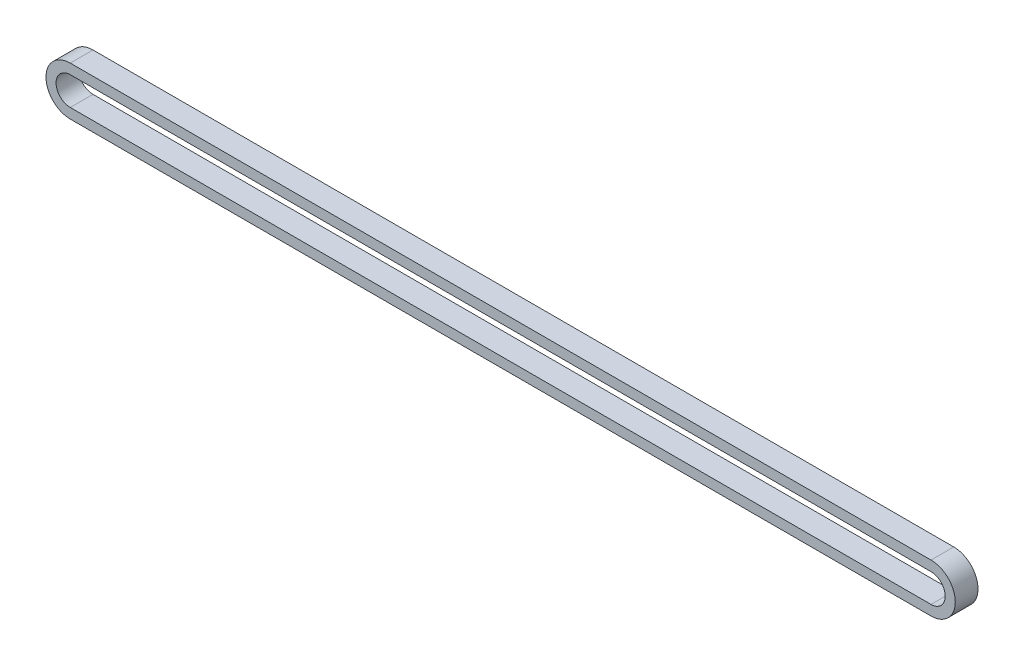
ISO-10303-21;
HEADER;
FILE_DESCRIPTION(('STEP AP214'),'2;1');
FILE_NAME('part.step','',(''),(''),'','','');
FILE_SCHEMA(('AUTOMOTIVE_DESIGN { 1 0 10303 214 1 1 1 1 }'));
ENDSEC;
DATA;
#1=APPLICATION_CONTEXT('core data for automotive mechanical design processes');
#2=APPLICATION_PROTOCOL_DEFINITION('international standard','automotive_design',2000,#1);
#3=PRODUCT_CONTEXT('',#1,'mechanical');
#4=PRODUCT('Part','Part','',(#3));
#5=PRODUCT_RELATED_PRODUCT_CATEGORY('part','',(#4));
#6=PRODUCT_DEFINITION_FORMATION('','',#4);
#7=PRODUCT_DEFINITION_CONTEXT('part definition',#1,'design');
#8=PRODUCT_DEFINITION('design','',#6,#7);
#9=PRODUCT_DEFINITION_SHAPE('','',#8);
#10=(LENGTH_UNIT() NAMED_UNIT(*) SI_UNIT(.MILLI.,.METRE.));
#11=(NAMED_UNIT(*) PLANE_ANGLE_UNIT() SI_UNIT($,.RADIAN.));
#12=(NAMED_UNIT(*) SI_UNIT($,.STERADIAN.) SOLID_ANGLE_UNIT());
#13=UNCERTAINTY_MEASURE_WITH_UNIT(LENGTH_MEASURE(1.E-05),#10,'distance_accuracy_value','');
#14=(GEOMETRIC_REPRESENTATION_CONTEXT(3) GLOBAL_UNCERTAINTY_ASSIGNED_CONTEXT((#13)) GLOBAL_UNIT_ASSIGNED_CONTEXT((#10,
#11,#12)) REPRESENTATION_CONTEXT('',''));
#15=CARTESIAN_POINT('',(0.,0.,0.));
#16=DIRECTION('',(0.,0.,1.));
#17=DIRECTION('',(1.,0.,0.));
#18=AXIS2_PLACEMENT_3D('',#15,#16,#17);
#19=CARTESIAN_POINT('',(0.,0.,3.));
#20=DIRECTION('',(0.,0.,1.));
#21=DIRECTION('',(1.,0.,0.));
#22=AXIS2_PLACEMENT_3D('',#19,#20,#21);
#23=PLANE('',#22);
#24=CARTESIAN_POINT('',(0.,0.,3.));
#25=DIRECTION('',(0.,0.,1.));
#26=DIRECTION('',(1.,0.,0.));
#27=AXIS2_PLACEMENT_3D('',#24,#25,#26);
#28=CIRCLE('',#27,3.2);
#29=CARTESIAN_POINT('',(0.,3.20000000000001,3.));
#30=VERTEX_POINT('',#29);
#31=CARTESIAN_POINT('',(0.,-3.19999999999999,3.));
#32=VERTEX_POINT('',#31);
#33=EDGE_CURVE('E142',#30,#32,#28,.T.);
#34=ORIENTED_EDGE('',*,*,#33,.T.);
#35=DIRECTION('',(1.,0.,0.));
#36=VECTOR('',#35,1.);
#37=CARTESIAN_POINT('',(0.,-3.19999999999999,3.));
#38=LINE('',#37,#36);
#39=CARTESIAN_POINT('',(113.6,-3.20000000000001,3.));
#40=VERTEX_POINT('',#39);
#41=EDGE_CURVE('E145',#32,#40,#38,.T.);
#42=ORIENTED_EDGE('',*,*,#41,.T.);
#43=CARTESIAN_POINT('',(113.6,0.,3.));
#44=DIRECTION('',(0.,0.,1.));
#45=DIRECTION('',(1.,0.,0.));
#46=AXIS2_PLACEMENT_3D('',#43,#44,#45);
#47=CIRCLE('',#46,3.20000000000001);
#48=CARTESIAN_POINT('',(113.6,3.20000000000001,3.));
#49=VERTEX_POINT('',#48);
#50=EDGE_CURVE('E148',#40,#49,#47,.T.);
#51=ORIENTED_EDGE('',*,*,#50,.T.);
#52=DIRECTION('',(-1.,0.,0.));
#53=VECTOR('',#52,1.);
#54=CARTESIAN_POINT('',(0.,3.20000000000001,3.));
#55=LINE('',#54,#53);
#56=EDGE_CURVE('E150',#49,#30,#55,.T.);
#57=ORIENTED_EDGE('',*,*,#56,.T.);
#58=EDGE_LOOP('',(#34,#42,#51,#57));
#59=FACE_BOUND('',#58,.T.);
#60=DIRECTION('',(1.,0.,0.));
#61=VECTOR('',#60,1.);
#62=CARTESIAN_POINT('',(0.,-1.87199999999999,3.));
#63=LINE('',#62,#61);
#64=CARTESIAN_POINT('',(0.,-1.87199999999999,3.));
#65=VERTEX_POINT('',#64);
#66=CARTESIAN_POINT('',(113.6,-1.87200000000001,3.));
#67=VERTEX_POINT('',#66);
#68=EDGE_CURVE('E114',#65,#67,#63,.T.);
#69=ORIENTED_EDGE('',*,*,#68,.F.);
#70=CARTESIAN_POINT('',(0.,0.,3.));
#71=DIRECTION('',(0.,0.,1.));
#72=DIRECTION('',(1.,0.,0.));
#73=AXIS2_PLACEMENT_3D('',#70,#71,#72);
#74=CIRCLE('',#73,1.872);
#75=CARTESIAN_POINT('',(0.,1.87200000000001,3.));
#76=VERTEX_POINT('',#75);
#77=EDGE_CURVE('E106',#76,#65,#74,.T.);
#78=ORIENTED_EDGE('',*,*,#77,.F.);
#79=DIRECTION('',(-1.,0.,0.));
#80=VECTOR('',#79,1.);
#81=CARTESIAN_POINT('',(0.,1.87200000000001,3.));
#82=LINE('',#81,#80);
#83=CARTESIAN_POINT('',(113.6,1.87200000000001,3.));
#84=VERTEX_POINT('',#83);
#85=EDGE_CURVE('E128',#84,#76,#82,.T.);
#86=ORIENTED_EDGE('',*,*,#85,.F.);
#87=CARTESIAN_POINT('',(113.6,0.,3.));
#88=DIRECTION('',(0.,0.,1.));
#89=DIRECTION('',(1.,0.,0.));
#90=AXIS2_PLACEMENT_3D('',#87,#88,#89);
#91=CIRCLE('',#90,1.87200000000001);
#92=EDGE_CURVE('E126',#67,#84,#91,.T.);
#93=ORIENTED_EDGE('',*,*,#92,.F.);
#94=EDGE_LOOP('',(#69,#78,#86,#93));
#95=FACE_BOUND('',#94,.T.);
#96=ADVANCED_FACE('F41',(#59,#95),#23,.T.);
#97=CARTESIAN_POINT('',(0.,0.,0.));
#98=DIRECTION('',(0.,0.,1.));
#99=DIRECTION('',(1.,0.,0.));
#100=AXIS2_PLACEMENT_3D('',#97,#98,#99);
#101=PLANE('',#100);
#102=CARTESIAN_POINT('',(0.,0.,0.));
#103=DIRECTION('',(0.,0.,1.));
#104=DIRECTION('',(1.,0.,0.));
#105=AXIS2_PLACEMENT_3D('',#102,#103,#104);
#106=CIRCLE('',#105,3.2);
#107=CARTESIAN_POINT('',(0.,3.20000000000001,0.));
#108=VERTEX_POINT('',#107);
#109=CARTESIAN_POINT('',(0.,-3.19999999999999,0.));
#110=VERTEX_POINT('',#109);
#111=EDGE_CURVE('E122',#108,#110,#106,.T.);
#112=ORIENTED_EDGE('',*,*,#111,.F.);
#113=DIRECTION('',(-1.,0.,0.));
#114=VECTOR('',#113,1.);
#115=CARTESIAN_POINT('',(0.,3.20000000000001,0.));
#116=LINE('',#115,#114);
#117=CARTESIAN_POINT('',(113.6,3.20000000000001,0.));
#118=VERTEX_POINT('',#117);
#119=EDGE_CURVE('E146',#118,#108,#116,.T.);
#120=ORIENTED_EDGE('',*,*,#119,.F.);
#121=CARTESIAN_POINT('',(113.6,0.,0.));
#122=DIRECTION('',(0.,0.,1.));
#123=DIRECTION('',(1.,0.,0.));
#124=AXIS2_PLACEMENT_3D('',#121,#122,#123);
#125=CIRCLE('',#124,3.20000000000001);
#126=CARTESIAN_POINT('',(113.6,-3.20000000000001,0.));
#127=VERTEX_POINT('',#126);
#128=EDGE_CURVE('E157',#127,#118,#125,.T.);
#129=ORIENTED_EDGE('',*,*,#128,.F.);
#130=DIRECTION('',(1.,0.,0.));
#131=VECTOR('',#130,1.);
#132=CARTESIAN_POINT('',(0.,-3.19999999999999,0.));
#133=LINE('',#132,#131);
#134=EDGE_CURVE('E155',#110,#127,#133,.T.);
#135=ORIENTED_EDGE('',*,*,#134,.F.);
#136=EDGE_LOOP('',(#112,#120,#129,#135));
#137=FACE_BOUND('',#136,.T.);
#138=CARTESIAN_POINT('',(0.,0.,0.));
#139=DIRECTION('',(0.,0.,1.));
#140=DIRECTION('',(1.,0.,0.));
#141=AXIS2_PLACEMENT_3D('',#138,#139,#140);
#142=CIRCLE('',#141,1.872);
#143=CARTESIAN_POINT('',(0.,1.87200000000001,0.));
#144=VERTEX_POINT('',#143);
#145=CARTESIAN_POINT('',(0.,-1.87199999999999,0.));
#146=VERTEX_POINT('',#145);
#147=EDGE_CURVE('E64',#144,#146,#142,.T.);
#148=ORIENTED_EDGE('',*,*,#147,.T.);
#149=DIRECTION('',(1.,0.,0.));
#150=VECTOR('',#149,1.);
#151=CARTESIAN_POINT('',(0.,-1.87199999999999,0.));
#152=LINE('',#151,#150);
#153=CARTESIAN_POINT('',(113.6,-1.87200000000001,0.));
#154=VERTEX_POINT('',#153);
#155=EDGE_CURVE('E121',#146,#154,#152,.T.);
#156=ORIENTED_EDGE('',*,*,#155,.T.);
#157=CARTESIAN_POINT('',(113.6,0.,0.));
#158=DIRECTION('',(0.,0.,1.));
#159=DIRECTION('',(1.,0.,0.));
#160=AXIS2_PLACEMENT_3D('',#157,#158,#159);
#161=CIRCLE('',#160,1.87200000000001);
#162=CARTESIAN_POINT('',(113.6,1.87200000000001,0.));
#163=VERTEX_POINT('',#162);
#164=EDGE_CURVE('E134',#154,#163,#161,.T.);
#165=ORIENTED_EDGE('',*,*,#164,.T.);
#166=DIRECTION('',(-1.,0.,0.));
#167=VECTOR('',#166,1.);
#168=CARTESIAN_POINT('',(0.,1.87200000000001,0.));
#169=LINE('',#168,#167);
#170=EDGE_CURVE('E115',#163,#144,#169,.T.);
#171=ORIENTED_EDGE('',*,*,#170,.T.);
#172=EDGE_LOOP('',(#148,#156,#165,#171));
#173=FACE_BOUND('',#172,.T.);
#174=ADVANCED_FACE('F175',(#137,#173),#101,.F.);
#175=CARTESIAN_POINT('',(0.,0.,3.));
#176=DIRECTION('',(0.,0.,-1.));
#177=DIRECTION('',(-1.,0.,0.));
#178=AXIS2_PLACEMENT_3D('',#175,#176,#177);
#179=CYLINDRICAL_SURFACE('',#178,3.2);
#180=ORIENTED_EDGE('',*,*,#111,.T.);
#181=DIRECTION('',(0.,0.,-1.));
#182=VECTOR('',#181,1.);
#183=CARTESIAN_POINT('',(0.,-3.19999999999999,3.));
#184=LINE('',#183,#182);
#185=EDGE_CURVE('E11',#32,#110,#184,.T.);
#186=ORIENTED_EDGE('',*,*,#185,.F.);
#187=ORIENTED_EDGE('',*,*,#33,.F.);
#188=DIRECTION('',(0.,0.,-1.));
#189=VECTOR('',#188,1.);
#190=CARTESIAN_POINT('',(0.,3.20000000000001,3.));
#191=LINE('',#190,#189);
#192=EDGE_CURVE('E152',#30,#108,#191,.T.);
#193=ORIENTED_EDGE('',*,*,#192,.T.);
#194=EDGE_LOOP('',(#180,#186,#187,#193));
#195=FACE_BOUND('',#194,.T.);
#196=ADVANCED_FACE('F43',(#195),#179,.T.);
#197=CARTESIAN_POINT('',(0.,-3.19999999999999,3.));
#198=DIRECTION('',(0.,1.,0.));
#199=DIRECTION('',(-1.,0.,0.));
#200=AXIS2_PLACEMENT_3D('',#197,#198,#199);
#201=PLANE('',#200);
#202=ORIENTED_EDGE('',*,*,#134,.T.);
#203=DIRECTION('',(0.,0.,-1.));
#204=VECTOR('',#203,1.);
#205=CARTESIAN_POINT('',(113.6,-3.20000000000001,3.));
#206=LINE('',#205,#204);
#207=EDGE_CURVE('E49',#40,#127,#206,.T.);
#208=ORIENTED_EDGE('',*,*,#207,.F.);
#209=ORIENTED_EDGE('',*,*,#41,.F.);
#210=ORIENTED_EDGE('',*,*,#185,.T.);
#211=EDGE_LOOP('',(#202,#208,#209,#210));
#212=FACE_BOUND('',#211,.T.);
#213=ADVANCED_FACE('F185',(#212),#201,.F.);
#214=CARTESIAN_POINT('',(113.6,0.,3.));
#215=DIRECTION('',(0.,0.,-1.));
#216=DIRECTION('',(-1.,0.,0.));
#217=AXIS2_PLACEMENT_3D('',#214,#215,#216);
#218=CYLINDRICAL_SURFACE('',#217,3.20000000000001);
#219=ORIENTED_EDGE('',*,*,#128,.T.);
#220=DIRECTION('',(0.,0.,-1.));
#221=VECTOR('',#220,1.);
#222=CARTESIAN_POINT('',(113.6,3.20000000000001,3.));
#223=LINE('',#222,#221);
#224=EDGE_CURVE('E162',#49,#118,#223,.T.);
#225=ORIENTED_EDGE('',*,*,#224,.F.);
#226=ORIENTED_EDGE('',*,*,#50,.F.);
#227=ORIENTED_EDGE('',*,*,#207,.T.);
#228=EDGE_LOOP('',(#219,#225,#226,#227));
#229=FACE_BOUND('',#228,.T.);
#230=ADVANCED_FACE('F169',(#229),#218,.T.);
#231=CARTESIAN_POINT('',(0.,3.20000000000001,3.));
#232=DIRECTION('',(0.,-1.,0.));
#233=DIRECTION('',(1.,0.,0.));
#234=AXIS2_PLACEMENT_3D('',#231,#232,#233);
#235=PLANE('',#234);
#236=ORIENTED_EDGE('',*,*,#119,.T.);
#237=ORIENTED_EDGE('',*,*,#192,.F.);
#238=ORIENTED_EDGE('',*,*,#56,.F.);
#239=ORIENTED_EDGE('',*,*,#224,.T.);
#240=EDGE_LOOP('',(#236,#237,#238,#239));
#241=FACE_BOUND('',#240,.T.);
#242=ADVANCED_FACE('F179',(#241),#235,.F.);
#243=CARTESIAN_POINT('',(0.,0.,3.));
#244=DIRECTION('',(0.,0.,-1.));
#245=DIRECTION('',(-1.,0.,0.));
#246=AXIS2_PLACEMENT_3D('',#243,#244,#245);
#247=CYLINDRICAL_SURFACE('',#246,1.872);
#248=ORIENTED_EDGE('',*,*,#147,.F.);
#249=DIRECTION('',(0.,0.,-1.));
#250=VECTOR('',#249,1.);
#251=CARTESIAN_POINT('',(0.,1.87200000000001,3.));
#252=LINE('',#251,#250);
#253=EDGE_CURVE('E110',#76,#144,#252,.T.);
#254=ORIENTED_EDGE('',*,*,#253,.F.);
#255=ORIENTED_EDGE('',*,*,#77,.T.);
#256=DIRECTION('',(0.,0.,-1.));
#257=VECTOR('',#256,1.);
#258=CARTESIAN_POINT('',(0.,-1.87199999999999,3.));
#259=LINE('',#258,#257);
#260=EDGE_CURVE('E109',#65,#146,#259,.T.);
#261=ORIENTED_EDGE('',*,*,#260,.T.);
#262=EDGE_LOOP('',(#248,#254,#255,#261));
#263=FACE_BOUND('',#262,.T.);
#264=ADVANCED_FACE('F108',(#263),#247,.F.);
#265=CARTESIAN_POINT('',(0.,-1.87199999999999,3.));
#266=DIRECTION('',(0.,1.,0.));
#267=DIRECTION('',(-1.,0.,0.));
#268=AXIS2_PLACEMENT_3D('',#265,#266,#267);
#269=PLANE('',#268);
#270=ORIENTED_EDGE('',*,*,#155,.F.);
#271=ORIENTED_EDGE('',*,*,#260,.F.);
#272=ORIENTED_EDGE('',*,*,#68,.T.);
#273=DIRECTION('',(0.,0.,-1.));
#274=VECTOR('',#273,1.);
#275=CARTESIAN_POINT('',(113.6,-1.87200000000001,3.));
#276=LINE('',#275,#274);
#277=EDGE_CURVE('E123',#67,#154,#276,.T.);
#278=ORIENTED_EDGE('',*,*,#277,.T.);
#279=EDGE_LOOP('',(#270,#271,#272,#278));
#280=FACE_BOUND('',#279,.T.);
#281=ADVANCED_FACE('F118',(#280),#269,.T.);
#282=CARTESIAN_POINT('',(113.6,0.,3.));
#283=DIRECTION('',(0.,0.,-1.));
#284=DIRECTION('',(-1.,0.,0.));
#285=AXIS2_PLACEMENT_3D('',#282,#283,#284);
#286=CYLINDRICAL_SURFACE('',#285,1.87200000000001);
#287=ORIENTED_EDGE('',*,*,#164,.F.);
#288=ORIENTED_EDGE('',*,*,#277,.F.);
#289=ORIENTED_EDGE('',*,*,#92,.T.);
#290=DIRECTION('',(0.,0.,-1.));
#291=VECTOR('',#290,1.);
#292=CARTESIAN_POINT('',(113.6,1.87200000000001,3.));
#293=LINE('',#292,#291);
#294=EDGE_CURVE('E56',#84,#163,#293,.T.);
#295=ORIENTED_EDGE('',*,*,#294,.T.);
#296=EDGE_LOOP('',(#287,#288,#289,#295));
#297=FACE_BOUND('',#296,.T.);
#298=ADVANCED_FACE('F208',(#297),#286,.F.);
#299=CARTESIAN_POINT('',(0.,1.87200000000001,3.));
#300=DIRECTION('',(0.,-1.,0.));
#301=DIRECTION('',(0.,0.,-1.));
#302=AXIS2_PLACEMENT_3D('',#299,#300,#301);
#303=PLANE('',#302);
#304=ORIENTED_EDGE('',*,*,#170,.F.);
#305=ORIENTED_EDGE('',*,*,#294,.F.);
#306=ORIENTED_EDGE('',*,*,#85,.T.);
#307=ORIENTED_EDGE('',*,*,#253,.T.);
#308=EDGE_LOOP('',(#304,#305,#306,#307));
#309=FACE_BOUND('',#308,.T.);
#310=ADVANCED_FACE('F212',(#309),#303,.T.);
#311=CLOSED_SHELL('',(#96,#174,#196,#213,#230,#242,#264,#281,#298,#310));
#312=MANIFOLD_SOLID_BREP('B2',#311);
#313=ADVANCED_BREP_SHAPE_REPRESENTATION('',(#18,#312),#14);
#314=SHAPE_DEFINITION_REPRESENTATION(#9,#313);
ENDSEC;
END-ISO-10303-21;
